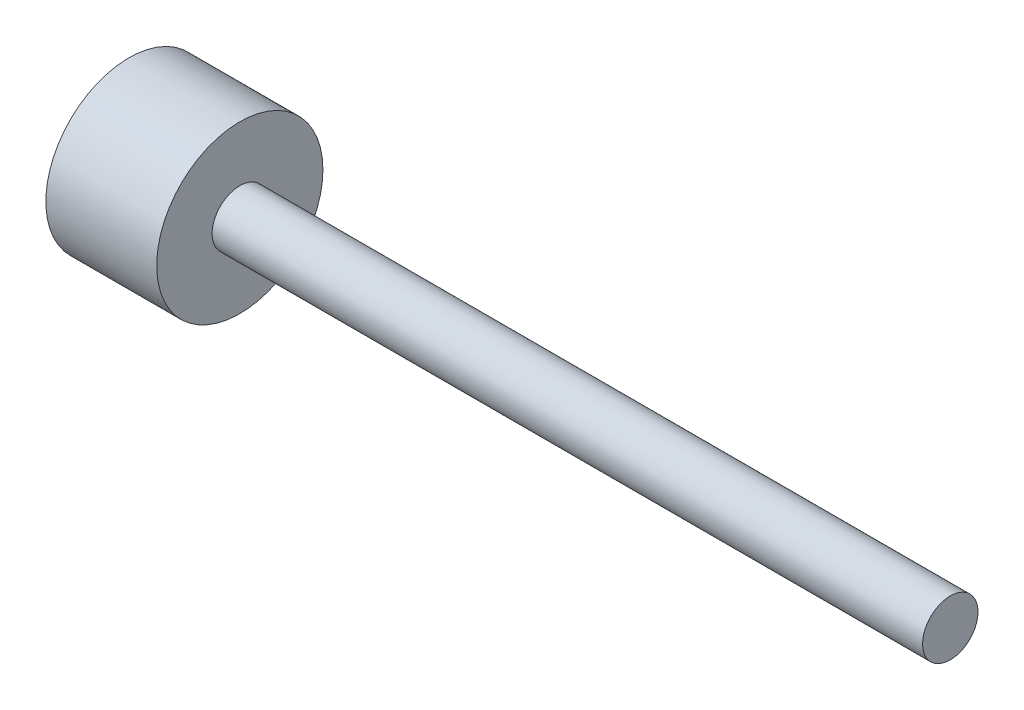
ISO-10303-21;
HEADER;
FILE_DESCRIPTION(('STEP AP214'),'2;1');
FILE_NAME('part.step','',(''),(''),'','','');
FILE_SCHEMA(('AUTOMOTIVE_DESIGN { 1 0 10303 214 1 1 1 1 }'));
ENDSEC;
DATA;
#1=APPLICATION_CONTEXT('core data for automotive mechanical design processes');
#2=APPLICATION_PROTOCOL_DEFINITION('international standard','automotive_design',2000,#1);
#3=PRODUCT_CONTEXT('',#1,'mechanical');
#4=PRODUCT('Part','Part','',(#3));
#5=PRODUCT_RELATED_PRODUCT_CATEGORY('part','',(#4));
#6=PRODUCT_DEFINITION_FORMATION('','',#4);
#7=PRODUCT_DEFINITION_CONTEXT('part definition',#1,'design');
#8=PRODUCT_DEFINITION('design','',#6,#7);
#9=PRODUCT_DEFINITION_SHAPE('','',#8);
#10=(LENGTH_UNIT() NAMED_UNIT(*) SI_UNIT(.MILLI.,.METRE.));
#11=(NAMED_UNIT(*) PLANE_ANGLE_UNIT() SI_UNIT($,.RADIAN.));
#12=(NAMED_UNIT(*) SI_UNIT($,.STERADIAN.) SOLID_ANGLE_UNIT());
#13=UNCERTAINTY_MEASURE_WITH_UNIT(LENGTH_MEASURE(1.E-05),#10,'distance_accuracy_value','');
#14=(GEOMETRIC_REPRESENTATION_CONTEXT(3) GLOBAL_UNCERTAINTY_ASSIGNED_CONTEXT((#13)) GLOBAL_UNIT_ASSIGNED_CONTEXT((#10,
#11,#12)) REPRESENTATION_CONTEXT('',''));
#15=CARTESIAN_POINT('',(0.,0.,0.));
#16=DIRECTION('',(0.,0.,1.));
#17=DIRECTION('',(1.,0.,0.));
#18=AXIS2_PLACEMENT_3D('',#15,#16,#17);
#19=CARTESIAN_POINT('',(12.7,0.,0.));
#20=DIRECTION('',(-1.,0.,0.));
#21=DIRECTION('',(0.,0.,1.));
#22=AXIS2_PLACEMENT_3D('',#19,#20,#21);
#23=CYLINDRICAL_SURFACE('',#22,9.525);
#24=CARTESIAN_POINT('',(12.7,0.,0.));
#25=DIRECTION('',(1.,0.,0.));
#26=DIRECTION('',(0.,0.,-1.));
#27=AXIS2_PLACEMENT_3D('',#24,#25,#26);
#28=CIRCLE('',#27,9.525);
#29=CARTESIAN_POINT('',(12.7,0.,-9.525));
#30=VERTEX_POINT('',#29);
#31=EDGE_CURVE('E10',#30,#30,#28,.T.);
#32=ORIENTED_EDGE('',*,*,#31,.F.);
#33=EDGE_LOOP('',(#32));
#34=FACE_BOUND('',#33,.T.);
#35=CARTESIAN_POINT('',(0.,0.,0.));
#36=DIRECTION('',(1.,0.,0.));
#37=DIRECTION('',(0.,0.,-1.));
#38=AXIS2_PLACEMENT_3D('',#35,#36,#37);
#39=CIRCLE('',#38,9.525);
#40=CARTESIAN_POINT('',(0.,0.,-9.525));
#41=VERTEX_POINT('',#40);
#42=EDGE_CURVE('E41',#41,#41,#39,.T.);
#43=ORIENTED_EDGE('',*,*,#42,.T.);
#44=EDGE_LOOP('',(#43));
#45=FACE_BOUND('',#44,.T.);
#46=ADVANCED_FACE('F38',(#34,#45),#23,.T.);
#47=CARTESIAN_POINT('',(12.7,0.,0.));
#48=DIRECTION('',(1.,0.,0.));
#49=DIRECTION('',(0.,0.,-1.));
#50=AXIS2_PLACEMENT_3D('',#47,#48,#49);
#51=PLANE('',#50);
#52=CARTESIAN_POINT('',(12.7,0.,0.));
#53=DIRECTION('',(1.,0.,0.));
#54=DIRECTION('',(0.,0.,-1.));
#55=AXIS2_PLACEMENT_3D('',#52,#53,#54);
#56=CIRCLE('',#55,3.175);
#57=CARTESIAN_POINT('',(12.7,0.,-3.175));
#58=VERTEX_POINT('',#57);
#59=EDGE_CURVE('E50',#58,#58,#56,.F.);
#60=ORIENTED_EDGE('',*,*,#59,.T.);
#61=EDGE_LOOP('',(#60));
#62=FACE_BOUND('',#61,.T.);
#63=ORIENTED_EDGE('',*,*,#31,.T.);
#64=EDGE_LOOP('',(#63));
#65=FACE_BOUND('',#64,.T.);
#66=ADVANCED_FACE('F72',(#62,#65),#51,.T.);
#67=CARTESIAN_POINT('',(0.,0.,0.));
#68=DIRECTION('',(1.,0.,0.));
#69=DIRECTION('',(0.,0.,-1.));
#70=AXIS2_PLACEMENT_3D('',#67,#68,#69);
#71=PLANE('',#70);
#72=ORIENTED_EDGE('',*,*,#42,.F.);
#73=EDGE_LOOP('',(#72));
#74=FACE_BOUND('',#73,.T.);
#75=ADVANCED_FACE('F64',(#74),#71,.F.);
#76=CARTESIAN_POINT('',(94.11,0.,0.));
#77=DIRECTION('',(-1.,0.,0.));
#78=DIRECTION('',(0.,0.,1.));
#79=AXIS2_PLACEMENT_3D('',#76,#77,#78);
#80=CYLINDRICAL_SURFACE('',#79,3.175);
#81=ORIENTED_EDGE('',*,*,#59,.F.);
#82=EDGE_LOOP('',(#81));
#83=FACE_BOUND('',#82,.T.);
#84=CARTESIAN_POINT('',(94.11,0.,0.));
#85=DIRECTION('',(1.,0.,0.));
#86=DIRECTION('',(0.,0.,-1.));
#87=AXIS2_PLACEMENT_3D('',#84,#85,#86);
#88=CIRCLE('',#87,3.175);
#89=CARTESIAN_POINT('',(94.11,0.,-3.175));
#90=VERTEX_POINT('',#89);
#91=EDGE_CURVE('E55',#90,#90,#88,.T.);
#92=ORIENTED_EDGE('',*,*,#91,.F.);
#93=EDGE_LOOP('',(#92));
#94=FACE_BOUND('',#93,.T.);
#95=ADVANCED_FACE('F62',(#83,#94),#80,.T.);
#96=CARTESIAN_POINT('',(94.11,0.,0.));
#97=DIRECTION('',(1.,0.,0.));
#98=DIRECTION('',(0.,0.,-1.));
#99=AXIS2_PLACEMENT_3D('',#96,#97,#98);
#100=PLANE('',#99);
#101=ORIENTED_EDGE('',*,*,#91,.T.);
#102=EDGE_LOOP('',(#101));
#103=FACE_BOUND('',#102,.T.);
#104=ADVANCED_FACE('F60',(#103),#100,.T.);
#105=CLOSED_SHELL('',(#46,#66,#75,#95,#104));
#106=MANIFOLD_SOLID_BREP('B2',#105);
#107=ADVANCED_BREP_SHAPE_REPRESENTATION('',(#18,#106),#14);
#108=SHAPE_DEFINITION_REPRESENTATION(#9,#107);
ENDSEC;
END-ISO-10303-21;
